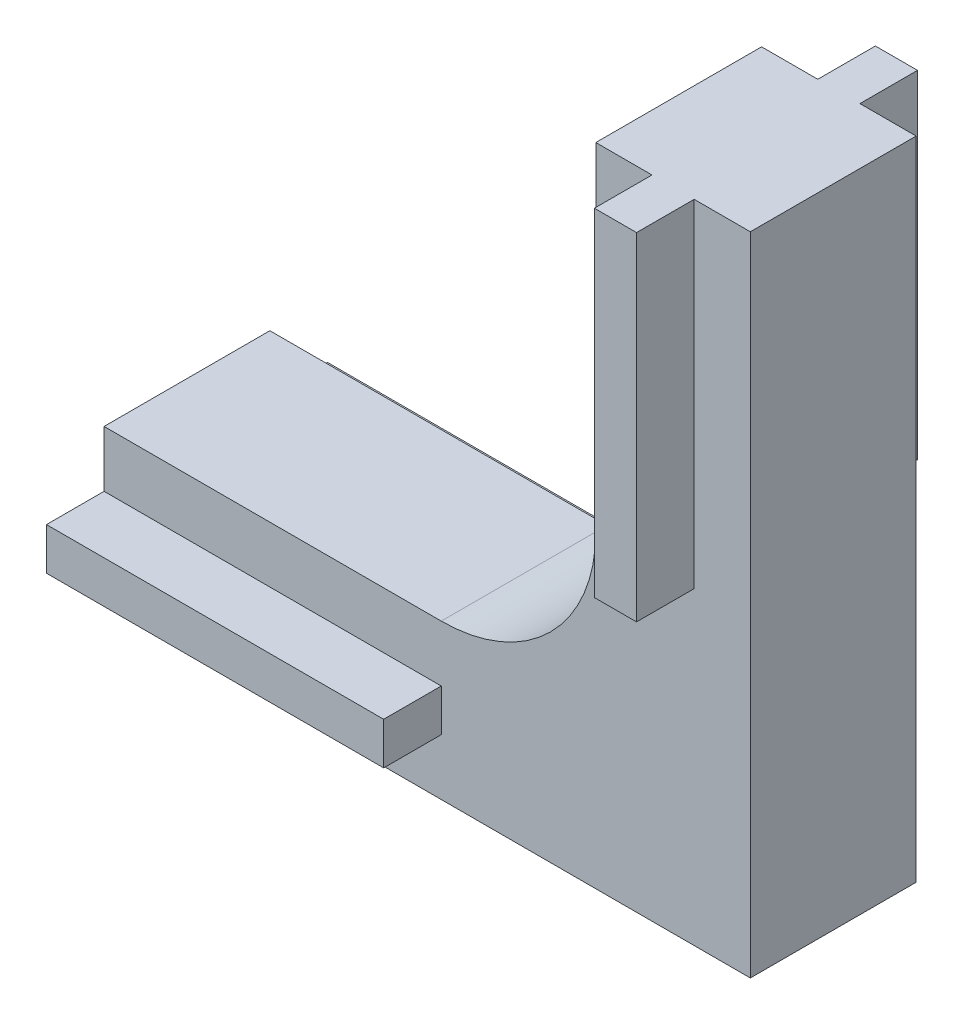
ISO-10303-21;
HEADER;
FILE_DESCRIPTION(('STEP AP214'),'2;1');
FILE_NAME('part.step','',(''),(''),'','','');
FILE_SCHEMA(('AUTOMOTIVE_DESIGN { 1 0 10303 214 1 1 1 1 }'));
ENDSEC;
DATA;
#1=APPLICATION_CONTEXT('core data for automotive mechanical design processes');
#2=APPLICATION_PROTOCOL_DEFINITION('international standard','automotive_design',2000,#1);
#3=PRODUCT_CONTEXT('',#1,'mechanical');
#4=PRODUCT('Part','Part','',(#3));
#5=PRODUCT_RELATED_PRODUCT_CATEGORY('part','',(#4));
#6=PRODUCT_DEFINITION_FORMATION('','',#4);
#7=PRODUCT_DEFINITION_CONTEXT('part definition',#1,'design');
#8=PRODUCT_DEFINITION('design','',#6,#7);
#9=PRODUCT_DEFINITION_SHAPE('','',#8);
#10=(LENGTH_UNIT() NAMED_UNIT(*) SI_UNIT(.MILLI.,.METRE.));
#11=(NAMED_UNIT(*) PLANE_ANGLE_UNIT() SI_UNIT($,.RADIAN.));
#12=(NAMED_UNIT(*) SI_UNIT($,.STERADIAN.) SOLID_ANGLE_UNIT());
#13=UNCERTAINTY_MEASURE_WITH_UNIT(LENGTH_MEASURE(1.E-05),#10,'distance_accuracy_value','');
#14=(GEOMETRIC_REPRESENTATION_CONTEXT(3) GLOBAL_UNCERTAINTY_ASSIGNED_CONTEXT((#13)) GLOBAL_UNIT_ASSIGNED_CONTEXT((#10,
#11,#12)) REPRESENTATION_CONTEXT('',''));
#15=CARTESIAN_POINT('',(0.,0.,0.));
#16=DIRECTION('',(0.,0.,1.));
#17=DIRECTION('',(1.,0.,0.));
#18=AXIS2_PLACEMENT_3D('',#15,#16,#17);
#19=CARTESIAN_POINT('',(12.,11.,5.9));
#20=DIRECTION('',(0.,0.,1.));
#21=DIRECTION('',(1.,0.,0.));
#22=AXIS2_PLACEMENT_3D('',#19,#20,#21);
#23=PLANE('',#22);
#24=DIRECTION('',(1.,0.,0.));
#25=VECTOR('',#24,1.);
#26=CARTESIAN_POINT('',(19.4999999999999,11.,5.9));
#27=LINE('',#26,#25);
#28=CARTESIAN_POINT('',(19.4999999999999,11.,5.9));
#29=VERTEX_POINT('',#28);
#30=CARTESIAN_POINT('',(20.9999999999999,11.,5.9));
#31=VERTEX_POINT('',#30);
#32=EDGE_CURVE('E269',#29,#31,#27,.T.);
#33=ORIENTED_EDGE('',*,*,#32,.F.);
#34=DIRECTION('',(0.,-1.,0.));
#35=VECTOR('',#34,1.);
#36=CARTESIAN_POINT('',(19.4999999999998,23.,5.9));
#37=LINE('',#36,#35);
#38=CARTESIAN_POINT('',(19.4999999999998,23.,5.9));
#39=VERTEX_POINT('',#38);
#40=EDGE_CURVE('E255',#39,#29,#37,.T.);
#41=ORIENTED_EDGE('',*,*,#40,.F.);
#42=DIRECTION('',(-1.,0.,0.));
#43=VECTOR('',#42,1.);
#44=CARTESIAN_POINT('',(17.5,23.,5.9));
#45=LINE('',#44,#43);
#46=CARTESIAN_POINT('',(17.5,23.,5.9));
#47=VERTEX_POINT('',#46);
#48=EDGE_CURVE('E323',#39,#47,#45,.T.);
#49=ORIENTED_EDGE('',*,*,#48,.T.);
#50=DIRECTION('',(0.,-1.,0.));
#51=VECTOR('',#50,1.);
#52=CARTESIAN_POINT('',(17.5,11.,5.9));
#53=LINE('',#52,#51);
#54=CARTESIAN_POINT('',(17.5,11.,5.9));
#55=VERTEX_POINT('',#54);
#56=EDGE_CURVE('E326',#47,#55,#53,.T.);
#57=ORIENTED_EDGE('',*,*,#56,.T.);
#58=CARTESIAN_POINT('',(12.,11.,5.9));
#59=DIRECTION('',(0.,0.,-1.));
#60=DIRECTION('',(1.,0.,0.));
#61=AXIS2_PLACEMENT_3D('',#58,#59,#60);
#62=CIRCLE('',#61,5.5);
#63=CARTESIAN_POINT('',(12.,5.5,5.9));
#64=VERTEX_POINT('',#63);
#65=EDGE_CURVE('E328',#55,#64,#62,.T.);
#66=ORIENTED_EDGE('',*,*,#65,.T.);
#67=DIRECTION('',(-1.,0.,0.));
#68=VECTOR('',#67,1.);
#69=CARTESIAN_POINT('',(0.,5.5,5.9));
#70=LINE('',#69,#68);
#71=CARTESIAN_POINT('',(0.,5.5,5.9));
#72=VERTEX_POINT('',#71);
#73=EDGE_CURVE('E330',#64,#72,#70,.T.);
#74=ORIENTED_EDGE('',*,*,#73,.T.);
#75=DIRECTION('',(0.,-1.,0.));
#76=VECTOR('',#75,1.);
#77=CARTESIAN_POINT('',(0.,0.,5.9));
#78=LINE('',#77,#76);
#79=CARTESIAN_POINT('',(0.,3.5,5.9));
#80=VERTEX_POINT('',#79);
#81=EDGE_CURVE('E316',#72,#80,#78,.T.);
#82=ORIENTED_EDGE('',*,*,#81,.T.);
#83=DIRECTION('',(-1.,0.,0.));
#84=VECTOR('',#83,1.);
#85=CARTESIAN_POINT('',(0.,3.5,5.9));
#86=LINE('',#85,#84);
#87=CARTESIAN_POINT('',(12.,3.5,5.9));
#88=VERTEX_POINT('',#87);
#89=EDGE_CURVE('E290',#88,#80,#86,.T.);
#90=ORIENTED_EDGE('',*,*,#89,.F.);
#91=DIRECTION('',(0.,1.,0.));
#92=VECTOR('',#91,1.);
#93=CARTESIAN_POINT('',(12.,3.5,5.9));
#94=LINE('',#93,#92);
#95=CARTESIAN_POINT('',(12.,2.,5.9));
#96=VERTEX_POINT('',#95);
#97=EDGE_CURVE('E299',#96,#88,#94,.T.);
#98=ORIENTED_EDGE('',*,*,#97,.F.);
#99=DIRECTION('',(1.,0.,0.));
#100=VECTOR('',#99,1.);
#101=CARTESIAN_POINT('',(0.,2.,5.9));
#102=LINE('',#101,#100);
#103=CARTESIAN_POINT('',(0.,2.,5.9));
#104=VERTEX_POINT('',#103);
#105=EDGE_CURVE('E285',#104,#96,#102,.T.);
#106=ORIENTED_EDGE('',*,*,#105,.F.);
#107=CARTESIAN_POINT('',(0.,0.,5.9));
#108=VERTEX_POINT('',#107);
#109=EDGE_CURVE('E319',#104,#108,#78,.T.);
#110=ORIENTED_EDGE('',*,*,#109,.T.);
#111=DIRECTION('',(1.,0.,0.));
#112=VECTOR('',#111,1.);
#113=CARTESIAN_POINT('',(0.,0.,5.9));
#114=LINE('',#113,#112);
#115=CARTESIAN_POINT('',(23.,0.,5.9));
#116=VERTEX_POINT('',#115);
#117=EDGE_CURVE('E318',#108,#116,#114,.T.);
#118=ORIENTED_EDGE('',*,*,#117,.T.);
#119=DIRECTION('',(0.,1.,0.));
#120=VECTOR('',#119,1.);
#121=CARTESIAN_POINT('',(23.,0.,5.9));
#122=LINE('',#121,#120);
#123=CARTESIAN_POINT('',(23.,23.,5.9));
#124=VERTEX_POINT('',#123);
#125=EDGE_CURVE('E321',#116,#124,#122,.T.);
#126=ORIENTED_EDGE('',*,*,#125,.T.);
#127=CARTESIAN_POINT('',(20.9999999999998,23.,5.9));
#128=VERTEX_POINT('',#127);
#129=EDGE_CURVE('E324',#124,#128,#45,.T.);
#130=ORIENTED_EDGE('',*,*,#129,.T.);
#131=DIRECTION('',(0.,1.,0.));
#132=VECTOR('',#131,1.);
#133=CARTESIAN_POINT('',(20.9999999999998,23.,5.9));
#134=LINE('',#133,#132);
#135=EDGE_CURVE('E260',#31,#128,#134,.T.);
#136=ORIENTED_EDGE('',*,*,#135,.F.);
#137=EDGE_LOOP('',(#33,#41,#49,#57,#66,#74,#82,#90,#98,#106,#110,#118,#126,#130,#136));
#138=FACE_BOUND('',#137,.T.);
#139=ADVANCED_FACE('F35',(#138),#23,.T.);
#140=CARTESIAN_POINT('',(0.,0.,5.9));
#141=DIRECTION('',(1.,0.,0.));
#142=DIRECTION('',(0.,0.,-1.));
#143=AXIS2_PLACEMENT_3D('',#140,#141,#142);
#144=PLANE('',#143);
#145=DIRECTION('',(0.,-1.,0.));
#146=VECTOR('',#145,1.);
#147=CARTESIAN_POINT('',(0.,0.,0.));
#148=LINE('',#147,#146);
#149=CARTESIAN_POINT('',(0.,5.5,0.));
#150=VERTEX_POINT('',#149);
#151=CARTESIAN_POINT('',(0.,3.5,0.));
#152=VERTEX_POINT('',#151);
#153=EDGE_CURVE('E333',#150,#152,#148,.T.);
#154=ORIENTED_EDGE('',*,*,#153,.T.);
#155=DIRECTION('',(0.,0.,1.));
#156=VECTOR('',#155,1.);
#157=CARTESIAN_POINT('',(0.,3.5,-2.05));
#158=LINE('',#157,#156);
#159=CARTESIAN_POINT('',(0.,3.5,-2.05));
#160=VERTEX_POINT('',#159);
#161=EDGE_CURVE('E58',#160,#152,#158,.T.);
#162=ORIENTED_EDGE('',*,*,#161,.F.);
#163=DIRECTION('',(0.,-1.,0.));
#164=VECTOR('',#163,1.);
#165=CARTESIAN_POINT('',(0.,3.5,-2.05));
#166=LINE('',#165,#164);
#167=CARTESIAN_POINT('',(0.,2.,-2.05));
#168=VERTEX_POINT('',#167);
#169=EDGE_CURVE('E230',#160,#168,#166,.T.);
#170=ORIENTED_EDGE('',*,*,#169,.T.);
#171=DIRECTION('',(0.,0.,1.));
#172=VECTOR('',#171,1.);
#173=CARTESIAN_POINT('',(0.,2.,-2.05));
#174=LINE('',#173,#172);
#175=CARTESIAN_POINT('',(0.,2.,0.));
#176=VERTEX_POINT('',#175);
#177=EDGE_CURVE('E242',#168,#176,#174,.T.);
#178=ORIENTED_EDGE('',*,*,#177,.T.);
#179=CARTESIAN_POINT('',(0.,0.,0.));
#180=VERTEX_POINT('',#179);
#181=EDGE_CURVE('E315',#176,#180,#148,.T.);
#182=ORIENTED_EDGE('',*,*,#181,.T.);
#183=DIRECTION('',(0.,0.,-1.));
#184=VECTOR('',#183,1.);
#185=CARTESIAN_POINT('',(0.,0.,5.9));
#186=LINE('',#185,#184);
#187=EDGE_CURVE('E11',#108,#180,#186,.T.);
#188=ORIENTED_EDGE('',*,*,#187,.F.);
#189=ORIENTED_EDGE('',*,*,#109,.F.);
#190=DIRECTION('',(0.,0.,-1.));
#191=VECTOR('',#190,1.);
#192=CARTESIAN_POINT('',(0.,2.,7.95));
#193=LINE('',#192,#191);
#194=CARTESIAN_POINT('',(0.,2.,7.95));
#195=VERTEX_POINT('',#194);
#196=EDGE_CURVE('E312',#195,#104,#193,.T.);
#197=ORIENTED_EDGE('',*,*,#196,.F.);
#198=DIRECTION('',(0.,-1.,0.));
#199=VECTOR('',#198,1.);
#200=CARTESIAN_POINT('',(0.,3.5,7.95));
#201=LINE('',#200,#199);
#202=CARTESIAN_POINT('',(0.,3.5,7.95));
#203=VERTEX_POINT('',#202);
#204=EDGE_CURVE('E286',#203,#195,#201,.T.);
#205=ORIENTED_EDGE('',*,*,#204,.F.);
#206=DIRECTION('',(0.,0.,-1.));
#207=VECTOR('',#206,1.);
#208=CARTESIAN_POINT('',(0.,3.5,7.95));
#209=LINE('',#208,#207);
#210=EDGE_CURVE('E296',#203,#80,#209,.T.);
#211=ORIENTED_EDGE('',*,*,#210,.T.);
#212=ORIENTED_EDGE('',*,*,#81,.F.);
#213=DIRECTION('',(0.,0.,-1.));
#214=VECTOR('',#213,1.);
#215=CARTESIAN_POINT('',(0.,5.5,5.9));
#216=LINE('',#215,#214);
#217=EDGE_CURVE('E332',#72,#150,#216,.T.);
#218=ORIENTED_EDGE('',*,*,#217,.T.);
#219=EDGE_LOOP('',(#154,#162,#170,#178,#182,#188,#189,#197,#205,#211,#212,#218));
#220=FACE_BOUND('',#219,.T.);
#221=ADVANCED_FACE('F37',(#220),#144,.F.);
#222=CARTESIAN_POINT('',(0.,0.,5.9));
#223=DIRECTION('',(0.,1.,0.));
#224=DIRECTION('',(0.,0.,1.));
#225=AXIS2_PLACEMENT_3D('',#222,#223,#224);
#226=PLANE('',#225);
#227=DIRECTION('',(1.,0.,0.));
#228=VECTOR('',#227,1.);
#229=CARTESIAN_POINT('',(0.,0.,0.));
#230=LINE('',#229,#228);
#231=CARTESIAN_POINT('',(23.,0.,0.));
#232=VERTEX_POINT('',#231);
#233=EDGE_CURVE('E336',#180,#232,#230,.T.);
#234=ORIENTED_EDGE('',*,*,#233,.T.);
#235=DIRECTION('',(0.,0.,-1.));
#236=VECTOR('',#235,1.);
#237=CARTESIAN_POINT('',(23.,0.,5.9));
#238=LINE('',#237,#236);
#239=EDGE_CURVE('E43',#116,#232,#238,.T.);
#240=ORIENTED_EDGE('',*,*,#239,.F.);
#241=ORIENTED_EDGE('',*,*,#117,.F.);
#242=ORIENTED_EDGE('',*,*,#187,.T.);
#243=EDGE_LOOP('',(#234,#240,#241,#242));
#244=FACE_BOUND('',#243,.T.);
#245=ADVANCED_FACE('F426',(#244),#226,.F.);
#246=CARTESIAN_POINT('',(23.,0.,5.9));
#247=DIRECTION('',(-1.,0.,0.));
#248=DIRECTION('',(0.,0.,1.));
#249=AXIS2_PLACEMENT_3D('',#246,#247,#248);
#250=PLANE('',#249);
#251=DIRECTION('',(0.,1.,0.));
#252=VECTOR('',#251,1.);
#253=CARTESIAN_POINT('',(23.,0.,0.));
#254=LINE('',#253,#252);
#255=CARTESIAN_POINT('',(23.,23.,0.));
#256=VERTEX_POINT('',#255);
#257=EDGE_CURVE('E338',#232,#256,#254,.T.);
#258=ORIENTED_EDGE('',*,*,#257,.T.);
#259=DIRECTION('',(0.,0.,-1.));
#260=VECTOR('',#259,1.);
#261=CARTESIAN_POINT('',(23.,23.,5.9));
#262=LINE('',#261,#260);
#263=EDGE_CURVE('E360',#124,#256,#262,.T.);
#264=ORIENTED_EDGE('',*,*,#263,.F.);
#265=ORIENTED_EDGE('',*,*,#125,.F.);
#266=ORIENTED_EDGE('',*,*,#239,.T.);
#267=EDGE_LOOP('',(#258,#264,#265,#266));
#268=FACE_BOUND('',#267,.T.);
#269=ADVANCED_FACE('F367',(#268),#250,.F.);
#270=CARTESIAN_POINT('',(17.5,23.,5.9));
#271=DIRECTION('',(0.,-1.,0.));
#272=DIRECTION('',(0.,0.,-1.));
#273=AXIS2_PLACEMENT_3D('',#270,#271,#272);
#274=PLANE('',#273);
#275=DIRECTION('',(-1.,0.,0.));
#276=VECTOR('',#275,1.);
#277=CARTESIAN_POINT('',(17.5,23.,0.));
#278=LINE('',#277,#276);
#279=CARTESIAN_POINT('',(20.9999999999998,23.,0.));
#280=VERTEX_POINT('',#279);
#281=EDGE_CURVE('E341',#256,#280,#278,.T.);
#282=ORIENTED_EDGE('',*,*,#281,.T.);
#283=DIRECTION('',(0.,0.,1.));
#284=VECTOR('',#283,1.);
#285=CARTESIAN_POINT('',(20.9999999999998,23.,-2.05));
#286=LINE('',#285,#284);
#287=CARTESIAN_POINT('',(20.9999999999998,23.,-2.05));
#288=VERTEX_POINT('',#287);
#289=EDGE_CURVE('E202',#288,#280,#286,.T.);
#290=ORIENTED_EDGE('',*,*,#289,.F.);
#291=DIRECTION('',(-1.,0.,0.));
#292=VECTOR('',#291,1.);
#293=CARTESIAN_POINT('',(19.4999999999998,23.,-2.05));
#294=LINE('',#293,#292);
#295=CARTESIAN_POINT('',(19.4999999999998,23.,-2.05));
#296=VERTEX_POINT('',#295);
#297=EDGE_CURVE('E208',#288,#296,#294,.T.);
#298=ORIENTED_EDGE('',*,*,#297,.T.);
#299=DIRECTION('',(0.,0.,1.));
#300=VECTOR('',#299,1.);
#301=CARTESIAN_POINT('',(19.4999999999998,23.,-2.05));
#302=LINE('',#301,#300);
#303=CARTESIAN_POINT('',(19.4999999999998,23.,0.));
#304=VERTEX_POINT('',#303);
#305=EDGE_CURVE('E191',#296,#304,#302,.T.);
#306=ORIENTED_EDGE('',*,*,#305,.T.);
#307=CARTESIAN_POINT('',(17.5,23.,0.));
#308=VERTEX_POINT('',#307);
#309=EDGE_CURVE('E340',#304,#308,#278,.T.);
#310=ORIENTED_EDGE('',*,*,#309,.T.);
#311=DIRECTION('',(0.,0.,-1.));
#312=VECTOR('',#311,1.);
#313=CARTESIAN_POINT('',(17.5,23.,5.9));
#314=LINE('',#313,#312);
#315=EDGE_CURVE('E357',#47,#308,#314,.T.);
#316=ORIENTED_EDGE('',*,*,#315,.F.);
#317=ORIENTED_EDGE('',*,*,#48,.F.);
#318=DIRECTION('',(0.,0.,-1.));
#319=VECTOR('',#318,1.);
#320=CARTESIAN_POINT('',(19.4999999999998,23.,7.95));
#321=LINE('',#320,#319);
#322=CARTESIAN_POINT('',(19.4999999999998,23.,7.95));
#323=VERTEX_POINT('',#322);
#324=EDGE_CURVE('E266',#323,#39,#321,.T.);
#325=ORIENTED_EDGE('',*,*,#324,.F.);
#326=DIRECTION('',(-1.,0.,0.));
#327=VECTOR('',#326,1.);
#328=CARTESIAN_POINT('',(19.4999999999998,23.,7.95));
#329=LINE('',#328,#327);
#330=CARTESIAN_POINT('',(20.9999999999998,23.,7.95));
#331=VERTEX_POINT('',#330);
#332=EDGE_CURVE('E264',#331,#323,#329,.T.);
#333=ORIENTED_EDGE('',*,*,#332,.F.);
#334=DIRECTION('',(0.,0.,-1.));
#335=VECTOR('',#334,1.);
#336=CARTESIAN_POINT('',(20.9999999999998,23.,7.95));
#337=LINE('',#336,#335);
#338=EDGE_CURVE('E276',#331,#128,#337,.T.);
#339=ORIENTED_EDGE('',*,*,#338,.T.);
#340=ORIENTED_EDGE('',*,*,#129,.F.);
#341=ORIENTED_EDGE('',*,*,#263,.T.);
#342=EDGE_LOOP('',(#282,#290,#298,#306,#310,#316,#317,#325,#333,#339,#340,#341));
#343=FACE_BOUND('',#342,.T.);
#344=ADVANCED_FACE('F215',(#343),#274,.F.);
#345=CARTESIAN_POINT('',(17.5,11.,5.9));
#346=DIRECTION('',(1.,0.,0.));
#347=DIRECTION('',(0.,0.,-1.));
#348=AXIS2_PLACEMENT_3D('',#345,#346,#347);
#349=PLANE('',#348);
#350=DIRECTION('',(0.,-1.,0.));
#351=VECTOR('',#350,1.);
#352=CARTESIAN_POINT('',(17.5,11.,0.));
#353=LINE('',#352,#351);
#354=CARTESIAN_POINT('',(17.5,11.,0.));
#355=VERTEX_POINT('',#354);
#356=EDGE_CURVE('E343',#308,#355,#353,.T.);
#357=ORIENTED_EDGE('',*,*,#356,.T.);
#358=DIRECTION('',(0.,0.,-1.));
#359=VECTOR('',#358,1.);
#360=CARTESIAN_POINT('',(17.5,11.,5.9));
#361=LINE('',#360,#359);
#362=EDGE_CURVE('E354',#55,#355,#361,.T.);
#363=ORIENTED_EDGE('',*,*,#362,.F.);
#364=ORIENTED_EDGE('',*,*,#56,.F.);
#365=ORIENTED_EDGE('',*,*,#315,.T.);
#366=EDGE_LOOP('',(#357,#363,#364,#365));
#367=FACE_BOUND('',#366,.T.);
#368=ADVANCED_FACE('F397',(#367),#349,.F.);
#369=CARTESIAN_POINT('',(12.,11.,5.9));
#370=DIRECTION('',(0.,0.,-1.));
#371=DIRECTION('',(-1.,0.,0.));
#372=AXIS2_PLACEMENT_3D('',#369,#370,#371);
#373=CYLINDRICAL_SURFACE('',#372,5.5);
#374=CARTESIAN_POINT('',(12.,11.,0.));
#375=DIRECTION('',(0.,0.,-1.));
#376=DIRECTION('',(1.,0.,0.));
#377=AXIS2_PLACEMENT_3D('',#374,#375,#376);
#378=CIRCLE('',#377,5.5);
#379=CARTESIAN_POINT('',(12.,5.5,0.));
#380=VERTEX_POINT('',#379);
#381=EDGE_CURVE('E345',#355,#380,#378,.T.);
#382=ORIENTED_EDGE('',*,*,#381,.T.);
#383=DIRECTION('',(0.,0.,-1.));
#384=VECTOR('',#383,1.);
#385=CARTESIAN_POINT('',(12.,5.5,5.9));
#386=LINE('',#385,#384);
#387=EDGE_CURVE('E351',#64,#380,#386,.T.);
#388=ORIENTED_EDGE('',*,*,#387,.F.);
#389=ORIENTED_EDGE('',*,*,#65,.F.);
#390=ORIENTED_EDGE('',*,*,#362,.T.);
#391=EDGE_LOOP('',(#382,#388,#389,#390));
#392=FACE_BOUND('',#391,.T.);
#393=ADVANCED_FACE('F403',(#392),#373,.F.);
#394=CARTESIAN_POINT('',(0.,5.5,5.9));
#395=DIRECTION('',(0.,-1.,0.));
#396=DIRECTION('',(0.,0.,-1.));
#397=AXIS2_PLACEMENT_3D('',#394,#395,#396);
#398=PLANE('',#397);
#399=DIRECTION('',(-1.,0.,0.));
#400=VECTOR('',#399,1.);
#401=CARTESIAN_POINT('',(0.,5.5,0.));
#402=LINE('',#401,#400);
#403=EDGE_CURVE('E347',#380,#150,#402,.T.);
#404=ORIENTED_EDGE('',*,*,#403,.T.);
#405=ORIENTED_EDGE('',*,*,#217,.F.);
#406=ORIENTED_EDGE('',*,*,#73,.F.);
#407=ORIENTED_EDGE('',*,*,#387,.T.);
#408=EDGE_LOOP('',(#404,#405,#406,#407));
#409=FACE_BOUND('',#408,.T.);
#410=ADVANCED_FACE('F407',(#409),#398,.F.);
#411=CARTESIAN_POINT('',(12.,11.,0.));
#412=DIRECTION('',(0.,0.,1.));
#413=DIRECTION('',(1.,0.,0.));
#414=AXIS2_PLACEMENT_3D('',#411,#412,#413);
#415=PLANE('',#414);
#416=ORIENTED_EDGE('',*,*,#309,.F.);
#417=DIRECTION('',(0.,-1.,0.));
#418=VECTOR('',#417,1.);
#419=CARTESIAN_POINT('',(19.4999999999998,23.,0.));
#420=LINE('',#419,#418);
#421=CARTESIAN_POINT('',(19.4999999999999,11.,0.));
#422=VERTEX_POINT('',#421);
#423=EDGE_CURVE('E197',#304,#422,#420,.T.);
#424=ORIENTED_EDGE('',*,*,#423,.T.);
#425=DIRECTION('',(1.,0.,0.));
#426=VECTOR('',#425,1.);
#427=CARTESIAN_POINT('',(19.4999999999999,11.,0.));
#428=LINE('',#427,#426);
#429=CARTESIAN_POINT('',(20.9999999999999,11.,0.));
#430=VERTEX_POINT('',#429);
#431=EDGE_CURVE('E212',#422,#430,#428,.T.);
#432=ORIENTED_EDGE('',*,*,#431,.T.);
#433=DIRECTION('',(0.,1.,0.));
#434=VECTOR('',#433,1.);
#435=CARTESIAN_POINT('',(20.9999999999998,23.,0.));
#436=LINE('',#435,#434);
#437=EDGE_CURVE('E50',#430,#280,#436,.T.);
#438=ORIENTED_EDGE('',*,*,#437,.T.);
#439=ORIENTED_EDGE('',*,*,#281,.F.);
#440=ORIENTED_EDGE('',*,*,#257,.F.);
#441=ORIENTED_EDGE('',*,*,#233,.F.);
#442=ORIENTED_EDGE('',*,*,#181,.F.);
#443=DIRECTION('',(1.,0.,0.));
#444=VECTOR('',#443,1.);
#445=CARTESIAN_POINT('',(0.,2.,0.));
#446=LINE('',#445,#444);
#447=CARTESIAN_POINT('',(12.,2.,0.));
#448=VERTEX_POINT('',#447);
#449=EDGE_CURVE('E234',#176,#448,#446,.T.);
#450=ORIENTED_EDGE('',*,*,#449,.T.);
#451=DIRECTION('',(0.,1.,0.));
#452=VECTOR('',#451,1.);
#453=CARTESIAN_POINT('',(12.,3.5,0.));
#454=LINE('',#453,#452);
#455=CARTESIAN_POINT('',(12.,3.5,0.));
#456=VERTEX_POINT('',#455);
#457=EDGE_CURVE('E244',#448,#456,#454,.T.);
#458=ORIENTED_EDGE('',*,*,#457,.T.);
#459=DIRECTION('',(-1.,0.,0.));
#460=VECTOR('',#459,1.);
#461=CARTESIAN_POINT('',(0.,3.5,0.));
#462=LINE('',#461,#460);
#463=EDGE_CURVE('E201',#456,#152,#462,.T.);
#464=ORIENTED_EDGE('',*,*,#463,.T.);
#465=ORIENTED_EDGE('',*,*,#153,.F.);
#466=ORIENTED_EDGE('',*,*,#403,.F.);
#467=ORIENTED_EDGE('',*,*,#381,.F.);
#468=ORIENTED_EDGE('',*,*,#356,.F.);
#469=EDGE_LOOP('',(#416,#424,#432,#438,#439,#440,#441,#442,#450,#458,#464,#465,#466,#467,#468));
#470=FACE_BOUND('',#469,.T.);
#471=ADVANCED_FACE('F374',(#470),#415,.F.);
#472=CARTESIAN_POINT('',(0.,2.,7.95));
#473=DIRECTION('',(0.,1.,0.));
#474=DIRECTION('',(0.,0.,1.));
#475=AXIS2_PLACEMENT_3D('',#472,#473,#474);
#476=PLANE('',#475);
#477=ORIENTED_EDGE('',*,*,#105,.T.);
#478=DIRECTION('',(0.,0.,-1.));
#479=VECTOR('',#478,1.);
#480=CARTESIAN_POINT('',(12.,2.,7.95));
#481=LINE('',#480,#479);
#482=CARTESIAN_POINT('',(12.,2.,7.95));
#483=VERTEX_POINT('',#482);
#484=EDGE_CURVE('E309',#483,#96,#481,.T.);
#485=ORIENTED_EDGE('',*,*,#484,.F.);
#486=DIRECTION('',(1.,0.,0.));
#487=VECTOR('',#486,1.);
#488=CARTESIAN_POINT('',(0.,2.,7.95));
#489=LINE('',#488,#487);
#490=EDGE_CURVE('E289',#195,#483,#489,.T.);
#491=ORIENTED_EDGE('',*,*,#490,.F.);
#492=ORIENTED_EDGE('',*,*,#196,.T.);
#493=EDGE_LOOP('',(#477,#485,#491,#492));
#494=FACE_BOUND('',#493,.T.);
#495=ADVANCED_FACE('F423',(#494),#476,.F.);
#496=CARTESIAN_POINT('',(12.,3.5,7.95));
#497=DIRECTION('',(-1.,0.,0.));
#498=DIRECTION('',(0.,0.,1.));
#499=AXIS2_PLACEMENT_3D('',#496,#497,#498);
#500=PLANE('',#499);
#501=ORIENTED_EDGE('',*,*,#97,.T.);
#502=DIRECTION('',(0.,0.,-1.));
#503=VECTOR('',#502,1.);
#504=CARTESIAN_POINT('',(12.,3.5,7.95));
#505=LINE('',#504,#503);
#506=CARTESIAN_POINT('',(12.,3.5,7.95));
#507=VERTEX_POINT('',#506);
#508=EDGE_CURVE('E306',#507,#88,#505,.T.);
#509=ORIENTED_EDGE('',*,*,#508,.F.);
#510=DIRECTION('',(0.,1.,0.));
#511=VECTOR('',#510,1.);
#512=CARTESIAN_POINT('',(12.,3.5,7.95));
#513=LINE('',#512,#511);
#514=EDGE_CURVE('E292',#483,#507,#513,.T.);
#515=ORIENTED_EDGE('',*,*,#514,.F.);
#516=ORIENTED_EDGE('',*,*,#484,.T.);
#517=EDGE_LOOP('',(#501,#509,#515,#516));
#518=FACE_BOUND('',#517,.T.);
#519=ADVANCED_FACE('F419',(#518),#500,.F.);
#520=CARTESIAN_POINT('',(0.,3.5,7.95));
#521=DIRECTION('',(0.,-1.,0.));
#522=DIRECTION('',(0.,0.,-1.));
#523=AXIS2_PLACEMENT_3D('',#520,#521,#522);
#524=PLANE('',#523);
#525=ORIENTED_EDGE('',*,*,#89,.T.);
#526=ORIENTED_EDGE('',*,*,#210,.F.);
#527=DIRECTION('',(-1.,0.,0.));
#528=VECTOR('',#527,1.);
#529=CARTESIAN_POINT('',(0.,3.5,7.95));
#530=LINE('',#529,#528);
#531=EDGE_CURVE('E294',#507,#203,#530,.T.);
#532=ORIENTED_EDGE('',*,*,#531,.F.);
#533=ORIENTED_EDGE('',*,*,#508,.T.);
#534=EDGE_LOOP('',(#525,#526,#532,#533));
#535=FACE_BOUND('',#534,.T.);
#536=ADVANCED_FACE('F414',(#535),#524,.F.);
#537=CARTESIAN_POINT('',(0.,0.,7.95));
#538=DIRECTION('',(0.,0.,1.));
#539=DIRECTION('',(1.,0.,0.));
#540=AXIS2_PLACEMENT_3D('',#537,#538,#539);
#541=PLANE('',#540);
#542=ORIENTED_EDGE('',*,*,#204,.T.);
#543=ORIENTED_EDGE('',*,*,#490,.T.);
#544=ORIENTED_EDGE('',*,*,#514,.T.);
#545=ORIENTED_EDGE('',*,*,#531,.T.);
#546=EDGE_LOOP('',(#542,#543,#544,#545));
#547=FACE_BOUND('',#546,.T.);
#548=ADVANCED_FACE('F487',(#547),#541,.T.);
#549=CARTESIAN_POINT('',(19.4999999999998,23.,7.95));
#550=DIRECTION('',(1.,0.,0.));
#551=DIRECTION('',(0.,1.,0.));
#552=AXIS2_PLACEMENT_3D('',#549,#550,#551);
#553=PLANE('',#552);
#554=ORIENTED_EDGE('',*,*,#40,.T.);
#555=DIRECTION('',(0.,0.,-1.));
#556=VECTOR('',#555,1.);
#557=CARTESIAN_POINT('',(19.4999999999999,11.,7.95));
#558=LINE('',#557,#556);
#559=CARTESIAN_POINT('',(19.4999999999999,11.,7.95));
#560=VERTEX_POINT('',#559);
#561=EDGE_CURVE('E282',#560,#29,#558,.T.);
#562=ORIENTED_EDGE('',*,*,#561,.F.);
#563=DIRECTION('',(0.,-1.,0.));
#564=VECTOR('',#563,1.);
#565=CARTESIAN_POINT('',(19.4999999999998,23.,7.95));
#566=LINE('',#565,#564);
#567=EDGE_CURVE('E256',#323,#560,#566,.T.);
#568=ORIENTED_EDGE('',*,*,#567,.F.);
#569=ORIENTED_EDGE('',*,*,#324,.T.);
#570=EDGE_LOOP('',(#554,#562,#568,#569));
#571=FACE_BOUND('',#570,.T.);
#572=ADVANCED_FACE('F392',(#571),#553,.F.);
#573=CARTESIAN_POINT('',(19.4999999999999,11.,7.95));
#574=DIRECTION('',(0.,1.,0.));
#575=DIRECTION('',(-1.,0.,0.));
#576=AXIS2_PLACEMENT_3D('',#573,#574,#575);
#577=PLANE('',#576);
#578=ORIENTED_EDGE('',*,*,#32,.T.);
#579=DIRECTION('',(0.,0.,-1.));
#580=VECTOR('',#579,1.);
#581=CARTESIAN_POINT('',(20.9999999999999,11.,7.95));
#582=LINE('',#581,#580);
#583=CARTESIAN_POINT('',(20.9999999999999,11.,7.95));
#584=VERTEX_POINT('',#583);
#585=EDGE_CURVE('E279',#584,#31,#582,.T.);
#586=ORIENTED_EDGE('',*,*,#585,.F.);
#587=DIRECTION('',(1.,0.,0.));
#588=VECTOR('',#587,1.);
#589=CARTESIAN_POINT('',(19.4999999999999,11.,7.95));
#590=LINE('',#589,#588);
#591=EDGE_CURVE('E259',#560,#584,#590,.T.);
#592=ORIENTED_EDGE('',*,*,#591,.F.);
#593=ORIENTED_EDGE('',*,*,#561,.T.);
#594=EDGE_LOOP('',(#578,#586,#592,#593));
#595=FACE_BOUND('',#594,.T.);
#596=ADVANCED_FACE('F385',(#595),#577,.F.);
#597=CARTESIAN_POINT('',(20.9999999999998,23.,7.95));
#598=DIRECTION('',(-1.,0.,0.));
#599=DIRECTION('',(0.,-1.,0.));
#600=AXIS2_PLACEMENT_3D('',#597,#598,#599);
#601=PLANE('',#600);
#602=ORIENTED_EDGE('',*,*,#135,.T.);
#603=ORIENTED_EDGE('',*,*,#338,.F.);
#604=DIRECTION('',(0.,1.,0.));
#605=VECTOR('',#604,1.);
#606=CARTESIAN_POINT('',(20.9999999999998,23.,7.95));
#607=LINE('',#606,#605);
#608=EDGE_CURVE('E262',#584,#331,#607,.T.);
#609=ORIENTED_EDGE('',*,*,#608,.F.);
#610=ORIENTED_EDGE('',*,*,#585,.T.);
#611=EDGE_LOOP('',(#602,#603,#609,#610));
#612=FACE_BOUND('',#611,.T.);
#613=ADVANCED_FACE('F381',(#612),#601,.F.);
#614=CARTESIAN_POINT('',(0.,0.,7.95));
#615=DIRECTION('',(0.,0.,1.));
#616=DIRECTION('',(1.,0.,0.));
#617=AXIS2_PLACEMENT_3D('',#614,#615,#616);
#618=PLANE('',#617);
#619=ORIENTED_EDGE('',*,*,#567,.T.);
#620=ORIENTED_EDGE('',*,*,#591,.T.);
#621=ORIENTED_EDGE('',*,*,#608,.T.);
#622=ORIENTED_EDGE('',*,*,#332,.T.);
#623=EDGE_LOOP('',(#619,#620,#621,#622));
#624=FACE_BOUND('',#623,.T.);
#625=ADVANCED_FACE('F513',(#624),#618,.T.);
#626=CARTESIAN_POINT('',(0.,3.5,-2.05));
#627=DIRECTION('',(0.,1.,0.));
#628=DIRECTION('',(0.,0.,1.));
#629=AXIS2_PLACEMENT_3D('',#626,#627,#628);
#630=PLANE('',#629);
#631=ORIENTED_EDGE('',*,*,#463,.F.);
#632=DIRECTION('',(0.,0.,1.));
#633=VECTOR('',#632,1.);
#634=CARTESIAN_POINT('',(12.,3.5,-2.05));
#635=LINE('',#634,#633);
#636=CARTESIAN_POINT('',(12.,3.5,-2.05));
#637=VERTEX_POINT('',#636);
#638=EDGE_CURVE('E252',#637,#456,#635,.T.);
#639=ORIENTED_EDGE('',*,*,#638,.F.);
#640=DIRECTION('',(-1.,0.,0.));
#641=VECTOR('',#640,1.);
#642=CARTESIAN_POINT('',(0.,3.5,-2.05));
#643=LINE('',#642,#641);
#644=EDGE_CURVE('E233',#637,#160,#643,.T.);
#645=ORIENTED_EDGE('',*,*,#644,.T.);
#646=ORIENTED_EDGE('',*,*,#161,.T.);
#647=EDGE_LOOP('',(#631,#639,#645,#646));
#648=FACE_BOUND('',#647,.T.);
#649=ADVANCED_FACE('F520',(#648),#630,.T.);
#650=CARTESIAN_POINT('',(12.,3.5,-2.05));
#651=DIRECTION('',(1.,0.,0.));
#652=DIRECTION('',(0.,0.,-1.));
#653=AXIS2_PLACEMENT_3D('',#650,#651,#652);
#654=PLANE('',#653);
#655=ORIENTED_EDGE('',*,*,#457,.F.);
#656=DIRECTION('',(0.,0.,1.));
#657=VECTOR('',#656,1.);
#658=CARTESIAN_POINT('',(12.,2.,-2.05));
#659=LINE('',#658,#657);
#660=CARTESIAN_POINT('',(12.,2.,-2.05));
#661=VERTEX_POINT('',#660);
#662=EDGE_CURVE('E250',#661,#448,#659,.T.);
#663=ORIENTED_EDGE('',*,*,#662,.F.);
#664=DIRECTION('',(0.,1.,0.));
#665=VECTOR('',#664,1.);
#666=CARTESIAN_POINT('',(12.,3.5,-2.05));
#667=LINE('',#666,#665);
#668=EDGE_CURVE('E236',#661,#637,#667,.T.);
#669=ORIENTED_EDGE('',*,*,#668,.T.);
#670=ORIENTED_EDGE('',*,*,#638,.T.);
#671=EDGE_LOOP('',(#655,#663,#669,#670));
#672=FACE_BOUND('',#671,.T.);
#673=ADVANCED_FACE('F527',(#672),#654,.T.);
#674=CARTESIAN_POINT('',(0.,2.,-2.05));
#675=DIRECTION('',(0.,-1.,0.));
#676=DIRECTION('',(0.,0.,-1.));
#677=AXIS2_PLACEMENT_3D('',#674,#675,#676);
#678=PLANE('',#677);
#679=ORIENTED_EDGE('',*,*,#449,.F.);
#680=ORIENTED_EDGE('',*,*,#177,.F.);
#681=DIRECTION('',(1.,0.,0.));
#682=VECTOR('',#681,1.);
#683=CARTESIAN_POINT('',(0.,2.,-2.05));
#684=LINE('',#683,#682);
#685=EDGE_CURVE('E239',#168,#661,#684,.T.);
#686=ORIENTED_EDGE('',*,*,#685,.T.);
#687=ORIENTED_EDGE('',*,*,#662,.T.);
#688=EDGE_LOOP('',(#679,#680,#686,#687));
#689=FACE_BOUND('',#688,.T.);
#690=ADVANCED_FACE('F534',(#689),#678,.T.);
#691=CARTESIAN_POINT('',(0.,0.,-2.05));
#692=DIRECTION('',(0.,0.,-1.));
#693=DIRECTION('',(1.,0.,0.));
#694=AXIS2_PLACEMENT_3D('',#691,#692,#693);
#695=PLANE('',#694);
#696=ORIENTED_EDGE('',*,*,#169,.F.);
#697=ORIENTED_EDGE('',*,*,#644,.F.);
#698=ORIENTED_EDGE('',*,*,#668,.F.);
#699=ORIENTED_EDGE('',*,*,#685,.F.);
#700=EDGE_LOOP('',(#696,#697,#698,#699));
#701=FACE_BOUND('',#700,.T.);
#702=ADVANCED_FACE('F542',(#701),#695,.T.);
#703=CARTESIAN_POINT('',(19.4999999999998,23.,-2.05));
#704=DIRECTION('',(-1.,0.,0.));
#705=DIRECTION('',(0.,-1.,0.));
#706=AXIS2_PLACEMENT_3D('',#703,#704,#705);
#707=PLANE('',#706);
#708=ORIENTED_EDGE('',*,*,#423,.F.);
#709=ORIENTED_EDGE('',*,*,#305,.F.);
#710=DIRECTION('',(0.,-1.,0.));
#711=VECTOR('',#710,1.);
#712=CARTESIAN_POINT('',(19.4999999999998,23.,-2.05));
#713=LINE('',#712,#711);
#714=CARTESIAN_POINT('',(19.4999999999999,11.,-2.05));
#715=VERTEX_POINT('',#714);
#716=EDGE_CURVE('E194',#296,#715,#713,.T.);
#717=ORIENTED_EDGE('',*,*,#716,.T.);
#718=DIRECTION('',(0.,0.,1.));
#719=VECTOR('',#718,1.);
#720=CARTESIAN_POINT('',(19.4999999999999,11.,-2.05));
#721=LINE('',#720,#719);
#722=EDGE_CURVE('E221',#715,#422,#721,.T.);
#723=ORIENTED_EDGE('',*,*,#722,.T.);
#724=EDGE_LOOP('',(#708,#709,#717,#723));
#725=FACE_BOUND('',#724,.T.);
#726=ADVANCED_FACE('F193',(#725),#707,.T.);
#727=CARTESIAN_POINT('',(20.9999999999998,23.,-2.05));
#728=DIRECTION('',(1.,0.,0.));
#729=DIRECTION('',(0.,1.,0.));
#730=AXIS2_PLACEMENT_3D('',#727,#728,#729);
#731=PLANE('',#730);
#732=ORIENTED_EDGE('',*,*,#437,.F.);
#733=DIRECTION('',(0.,0.,1.));
#734=VECTOR('',#733,1.);
#735=CARTESIAN_POINT('',(20.9999999999999,11.,-2.05));
#736=LINE('',#735,#734);
#737=CARTESIAN_POINT('',(20.9999999999999,11.,-2.05));
#738=VERTEX_POINT('',#737);
#739=EDGE_CURVE('E227',#738,#430,#736,.T.);
#740=ORIENTED_EDGE('',*,*,#739,.F.);
#741=DIRECTION('',(0.,1.,0.));
#742=VECTOR('',#741,1.);
#743=CARTESIAN_POINT('',(20.9999999999998,23.,-2.05));
#744=LINE('',#743,#742);
#745=EDGE_CURVE('E216',#738,#288,#744,.T.);
#746=ORIENTED_EDGE('',*,*,#745,.T.);
#747=ORIENTED_EDGE('',*,*,#289,.T.);
#748=EDGE_LOOP('',(#732,#740,#746,#747));
#749=FACE_BOUND('',#748,.T.);
#750=ADVANCED_FACE('F557',(#749),#731,.T.);
#751=CARTESIAN_POINT('',(19.4999999999999,11.,-2.05));
#752=DIRECTION('',(0.,-1.,0.));
#753=DIRECTION('',(1.,0.,0.));
#754=AXIS2_PLACEMENT_3D('',#751,#752,#753);
#755=PLANE('',#754);
#756=ORIENTED_EDGE('',*,*,#431,.F.);
#757=ORIENTED_EDGE('',*,*,#722,.F.);
#758=DIRECTION('',(1.,0.,0.));
#759=VECTOR('',#758,1.);
#760=CARTESIAN_POINT('',(19.4999999999999,11.,-2.05));
#761=LINE('',#760,#759);
#762=EDGE_CURVE('E211',#715,#738,#761,.T.);
#763=ORIENTED_EDGE('',*,*,#762,.T.);
#764=ORIENTED_EDGE('',*,*,#739,.T.);
#765=EDGE_LOOP('',(#756,#757,#763,#764));
#766=FACE_BOUND('',#765,.T.);
#767=ADVANCED_FACE('F564',(#766),#755,.T.);
#768=CARTESIAN_POINT('',(0.,0.,-2.05));
#769=DIRECTION('',(0.,0.,-1.));
#770=DIRECTION('',(1.,0.,0.));
#771=AXIS2_PLACEMENT_3D('',#768,#769,#770);
#772=PLANE('',#771);
#773=ORIENTED_EDGE('',*,*,#716,.F.);
#774=ORIENTED_EDGE('',*,*,#297,.F.);
#775=ORIENTED_EDGE('',*,*,#745,.F.);
#776=ORIENTED_EDGE('',*,*,#762,.F.);
#777=EDGE_LOOP('',(#773,#774,#775,#776));
#778=FACE_BOUND('',#777,.T.);
#779=ADVANCED_FACE('F206',(#778),#772,.T.);
#780=CLOSED_SHELL('',(#139,#221,#245,#269,#344,#368,#393,#410,#471,#495,#519,#536,#548,#572,
#596,#613,#625,#649,#673,#690,#702,#726,#750,#767,#779));
#781=MANIFOLD_SOLID_BREP('B2',#780);
#782=ADVANCED_BREP_SHAPE_REPRESENTATION('',(#18,#781),#14);
#783=SHAPE_DEFINITION_REPRESENTATION(#9,#782);
ENDSEC;
END-ISO-10303-21;
